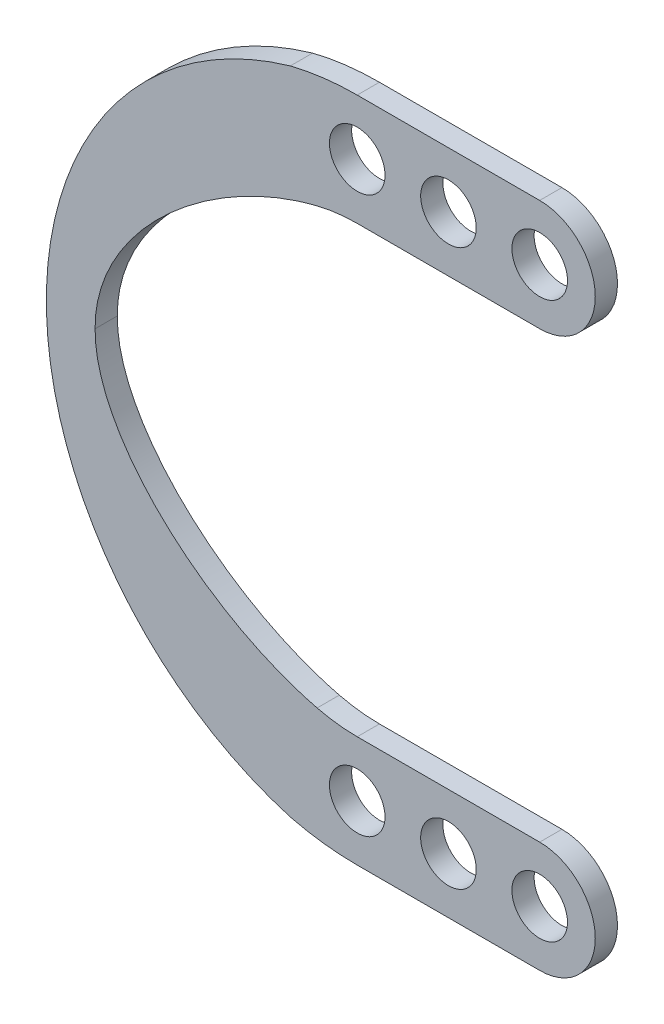
ISO-10303-21;
HEADER;
FILE_DESCRIPTION(('STEP AP214'),'2;1');
FILE_NAME('part.step','',(''),(''),'','','');
FILE_SCHEMA(('AUTOMOTIVE_DESIGN { 1 0 10303 214 1 1 1 1 }'));
ENDSEC;
DATA;
#1=APPLICATION_CONTEXT('core data for automotive mechanical design processes');
#2=APPLICATION_PROTOCOL_DEFINITION('international standard','automotive_design',2000,#1);
#3=PRODUCT_CONTEXT('',#1,'mechanical');
#4=PRODUCT('Part','Part','',(#3));
#5=PRODUCT_RELATED_PRODUCT_CATEGORY('part','',(#4));
#6=PRODUCT_DEFINITION_FORMATION('','',#4);
#7=PRODUCT_DEFINITION_CONTEXT('part definition',#1,'design');
#8=PRODUCT_DEFINITION('design','',#6,#7);
#9=PRODUCT_DEFINITION_SHAPE('','',#8);
#10=(LENGTH_UNIT() NAMED_UNIT(*) SI_UNIT(.MILLI.,.METRE.));
#11=(NAMED_UNIT(*) PLANE_ANGLE_UNIT() SI_UNIT($,.RADIAN.));
#12=(NAMED_UNIT(*) SI_UNIT($,.STERADIAN.) SOLID_ANGLE_UNIT());
#13=UNCERTAINTY_MEASURE_WITH_UNIT(LENGTH_MEASURE(1.E-05),#10,'distance_accuracy_value','');
#14=(GEOMETRIC_REPRESENTATION_CONTEXT(3) GLOBAL_UNCERTAINTY_ASSIGNED_CONTEXT((#13)) GLOBAL_UNIT_ASSIGNED_CONTEXT((#10,
#11,#12)) REPRESENTATION_CONTEXT('',''));
#15=CARTESIAN_POINT('',(0.,0.,0.));
#16=DIRECTION('',(0.,0.,1.));
#17=DIRECTION('',(1.,0.,0.));
#18=AXIS2_PLACEMENT_3D('',#15,#16,#17);
#19=CARTESIAN_POINT('',(0.,0.,2.));
#20=CARTESIAN_POINT('',(-0.0933459762474879,-8.13219904614453,2.));
#21=CARTESIAN_POINT('',(9.98710230848334,-17.0850852007355,2.));
#22=CARTESIAN_POINT('',(19.9745764255448,-19.5597289191086,2.));
#23=B_SPLINE_CURVE_WITH_KNOTS('',3,(#19,#20,#21,#22),.UNSPECIFIED.,.F.,.F.,(4,4),(0.,1.),.UNSPECIFIED.);
#24=DIRECTION('',(0.,0.,-1.));
#25=VECTOR('',#24,1.);
#26=SURFACE_OF_LINEAR_EXTRUSION('',#23,#25);
#27=CARTESIAN_POINT('',(0.,0.,0.));
#28=CARTESIAN_POINT('',(-0.0933459762474879,-8.13219904614453,0.));
#29=CARTESIAN_POINT('',(9.98710230848334,-17.0850852007355,0.));
#30=CARTESIAN_POINT('',(19.9745764255448,-19.5597289191086,0.));
#31=B_SPLINE_CURVE_WITH_KNOTS('',3,(#27,#28,#29,#30),.UNSPECIFIED.,.F.,.F.,(4,4),(0.,1.),.UNSPECIFIED.);
#32=CARTESIAN_POINT('',(0.,0.,0.));
#33=VERTEX_POINT('',#32);
#34=CARTESIAN_POINT('',(19.9745764255448,-19.5597289191086,0.));
#35=VERTEX_POINT('',#34);
#36=EDGE_CURVE('E180',#33,#35,#31,.T.);
#37=ORIENTED_EDGE('',*,*,#36,.F.);
#38=DIRECTION('',(0.,0.,-1.));
#39=VECTOR('',#38,1.);
#40=CARTESIAN_POINT('',(0.,0.,2.));
#41=LINE('',#40,#39);
#42=CARTESIAN_POINT('',(0.,0.,2.));
#43=VERTEX_POINT('',#42);
#44=EDGE_CURVE('E11',#43,#33,#41,.T.);
#45=ORIENTED_EDGE('',*,*,#44,.F.);
#46=CARTESIAN_POINT('',(19.9745764255448,-19.5597289191086,2.));
#47=VERTEX_POINT('',#46);
#48=EDGE_CURVE('E239',#43,#47,#23,.T.);
#49=ORIENTED_EDGE('',*,*,#48,.T.);
#50=DIRECTION('',(0.,0.,-1.));
#51=VECTOR('',#50,1.);
#52=CARTESIAN_POINT('',(19.9745764255448,-19.5597289191086,2.));
#53=LINE('',#52,#51);
#54=EDGE_CURVE('E54',#47,#35,#53,.T.);
#55=ORIENTED_EDGE('',*,*,#54,.T.);
#56=EDGE_LOOP('',(#37,#45,#49,#55));
#57=FACE_BOUND('',#56,.T.);
#58=ADVANCED_FACE('F37',(#57),#26,.T.);
#59=CARTESIAN_POINT('',(0.,0.,2.));
#60=CARTESIAN_POINT('',(-0.0933459762474879,8.13219904614453,2.));
#61=CARTESIAN_POINT('',(9.98710230848334,17.0850852007355,2.));
#62=CARTESIAN_POINT('',(19.9745764255448,19.5597289191086,2.));
#63=B_SPLINE_CURVE_WITH_KNOTS('',3,(#59,#60,#61,#62),.UNSPECIFIED.,.F.,.F.,(4,4),(0.,1.),.UNSPECIFIED.);
#64=DIRECTION('',(0.,0.,-1.));
#65=VECTOR('',#64,1.);
#66=SURFACE_OF_LINEAR_EXTRUSION('',#63,#65);
#67=CARTESIAN_POINT('',(0.,0.,0.));
#68=CARTESIAN_POINT('',(-0.0933459762474879,8.13219904614453,0.));
#69=CARTESIAN_POINT('',(9.98710230848334,17.0850852007355,0.));
#70=CARTESIAN_POINT('',(19.9745764255448,19.5597289191086,0.));
#71=B_SPLINE_CURVE_WITH_KNOTS('',3,(#67,#68,#69,#70),.UNSPECIFIED.,.F.,.F.,(4,4),(0.,1.),.UNSPECIFIED.);
#72=CARTESIAN_POINT('',(19.9745764255448,19.5597289191086,0.));
#73=VERTEX_POINT('',#72);
#74=EDGE_CURVE('E184',#33,#73,#71,.T.);
#75=ORIENTED_EDGE('',*,*,#74,.T.);
#76=DIRECTION('',(0.,0.,-1.));
#77=VECTOR('',#76,1.);
#78=CARTESIAN_POINT('',(19.9745764255448,19.5597289191086,2.));
#79=LINE('',#78,#77);
#80=CARTESIAN_POINT('',(19.9745764255448,19.5597289191086,2.));
#81=VERTEX_POINT('',#80);
#82=EDGE_CURVE('E46',#81,#73,#79,.T.);
#83=ORIENTED_EDGE('',*,*,#82,.F.);
#84=EDGE_CURVE('E285',#43,#81,#63,.T.);
#85=ORIENTED_EDGE('',*,*,#84,.F.);
#86=ORIENTED_EDGE('',*,*,#44,.T.);
#87=EDGE_LOOP('',(#75,#83,#85,#86));
#88=FACE_BOUND('',#87,.T.);
#89=ADVANCED_FACE('F324',(#88),#66,.F.);
#90=CARTESIAN_POINT('',(23.5821093501447,5.,2.));
#91=DIRECTION('',(0.,0.,-1.));
#92=DIRECTION('',(-1.,0.,0.));
#93=AXIS2_PLACEMENT_3D('',#90,#91,#92);
#94=CYLINDRICAL_SURFACE('',#93,15.);
#95=CARTESIAN_POINT('',(23.5821093501447,5.,0.));
#96=DIRECTION('',(0.,0.,1.));
#97=DIRECTION('',(1.,0.,0.));
#98=AXIS2_PLACEMENT_3D('',#95,#96,#97);
#99=CIRCLE('',#98,15.);
#100=CARTESIAN_POINT('',(23.5821093501447,20.,0.));
#101=VERTEX_POINT('',#100);
#102=EDGE_CURVE('E191',#73,#101,#99,.F.);
#103=ORIENTED_EDGE('',*,*,#102,.T.);
#104=DIRECTION('',(0.,0.,-1.));
#105=VECTOR('',#104,1.);
#106=CARTESIAN_POINT('',(23.5821093501447,20.,2.));
#107=LINE('',#106,#105);
#108=CARTESIAN_POINT('',(23.5821093501447,20.,2.));
#109=VERTEX_POINT('',#108);
#110=EDGE_CURVE('E257',#109,#101,#107,.T.);
#111=ORIENTED_EDGE('',*,*,#110,.F.);
#112=CARTESIAN_POINT('',(23.5821093501447,5.,2.));
#113=DIRECTION('',(0.,0.,1.));
#114=DIRECTION('',(1.,0.,0.));
#115=AXIS2_PLACEMENT_3D('',#112,#113,#114);
#116=CIRCLE('',#115,15.);
#117=EDGE_CURVE('E266',#81,#109,#116,.F.);
#118=ORIENTED_EDGE('',*,*,#117,.F.);
#119=ORIENTED_EDGE('',*,*,#82,.T.);
#120=EDGE_LOOP('',(#103,#111,#118,#119));
#121=FACE_BOUND('',#120,.T.);
#122=ADVANCED_FACE('F264',(#121),#94,.F.);
#123=CARTESIAN_POINT('',(0.,20.,2.));
#124=DIRECTION('',(0.,1.,0.));
#125=DIRECTION('',(0.,0.,1.));
#126=AXIS2_PLACEMENT_3D('',#123,#124,#125);
#127=PLANE('',#126);
#128=DIRECTION('',(1.,0.,0.));
#129=VECTOR('',#128,1.);
#130=CARTESIAN_POINT('',(0.,20.,0.));
#131=LINE('',#130,#129);
#132=CARTESIAN_POINT('',(40.,20.,0.));
#133=VERTEX_POINT('',#132);
#134=EDGE_CURVE('E196',#101,#133,#131,.T.);
#135=ORIENTED_EDGE('',*,*,#134,.T.);
#136=DIRECTION('',(0.,0.,-1.));
#137=VECTOR('',#136,1.);
#138=CARTESIAN_POINT('',(40.,20.,2.));
#139=LINE('',#138,#137);
#140=CARTESIAN_POINT('',(40.,20.,2.));
#141=VERTEX_POINT('',#140);
#142=EDGE_CURVE('E255',#141,#133,#139,.T.);
#143=ORIENTED_EDGE('',*,*,#142,.F.);
#144=DIRECTION('',(1.,0.,0.));
#145=VECTOR('',#144,1.);
#146=CARTESIAN_POINT('',(0.,20.,2.));
#147=LINE('',#146,#145);
#148=EDGE_CURVE('E279',#109,#141,#147,.T.);
#149=ORIENTED_EDGE('',*,*,#148,.F.);
#150=ORIENTED_EDGE('',*,*,#110,.T.);
#151=EDGE_LOOP('',(#135,#143,#149,#150));
#152=FACE_BOUND('',#151,.T.);
#153=ADVANCED_FACE('F276',(#152),#127,.F.);
#154=CARTESIAN_POINT('',(40.,25.,2.));
#155=DIRECTION('',(0.,0.,-1.));
#156=DIRECTION('',(-1.,0.,0.));
#157=AXIS2_PLACEMENT_3D('',#154,#155,#156);
#158=CYLINDRICAL_SURFACE('',#157,5.);
#159=CARTESIAN_POINT('',(40.,25.,0.));
#160=DIRECTION('',(0.,0.,1.));
#161=DIRECTION('',(1.,0.,0.));
#162=AXIS2_PLACEMENT_3D('',#159,#160,#161);
#163=CIRCLE('',#162,5.);
#164=CARTESIAN_POINT('',(40.,30.,0.));
#165=VERTEX_POINT('',#164);
#166=EDGE_CURVE('E199',#165,#133,#163,.F.);
#167=ORIENTED_EDGE('',*,*,#166,.F.);
#168=DIRECTION('',(0.,0.,-1.));
#169=VECTOR('',#168,1.);
#170=CARTESIAN_POINT('',(40.,30.,2.));
#171=LINE('',#170,#169);
#172=CARTESIAN_POINT('',(40.,30.,2.));
#173=VERTEX_POINT('',#172);
#174=EDGE_CURVE('E253',#173,#165,#171,.T.);
#175=ORIENTED_EDGE('',*,*,#174,.F.);
#176=CARTESIAN_POINT('',(40.,25.,2.));
#177=DIRECTION('',(0.,0.,1.));
#178=DIRECTION('',(1.,0.,0.));
#179=AXIS2_PLACEMENT_3D('',#176,#177,#178);
#180=CIRCLE('',#179,5.);
#181=EDGE_CURVE('E281',#173,#141,#180,.F.);
#182=ORIENTED_EDGE('',*,*,#181,.T.);
#183=ORIENTED_EDGE('',*,*,#142,.T.);
#184=EDGE_LOOP('',(#167,#175,#182,#183));
#185=FACE_BOUND('',#184,.T.);
#186=ADVANCED_FACE('F347',(#185),#158,.T.);
#187=CARTESIAN_POINT('',(0.,30.,2.));
#188=DIRECTION('',(0.,1.,0.));
#189=DIRECTION('',(-1.,0.,0.));
#190=AXIS2_PLACEMENT_3D('',#187,#188,#189);
#191=PLANE('',#190);
#192=DIRECTION('',(1.,0.,0.));
#193=VECTOR('',#192,1.);
#194=CARTESIAN_POINT('',(0.,30.,0.));
#195=LINE('',#194,#193);
#196=CARTESIAN_POINT('',(23.5821093501447,30.,0.));
#197=VERTEX_POINT('',#196);
#198=EDGE_CURVE('E202',#197,#165,#195,.T.);
#199=ORIENTED_EDGE('',*,*,#198,.F.);
#200=DIRECTION('',(0.,0.,-1.));
#201=VECTOR('',#200,1.);
#202=CARTESIAN_POINT('',(23.5821093501447,30.,2.));
#203=LINE('',#202,#201);
#204=CARTESIAN_POINT('',(23.5821093501447,30.,2.));
#205=VERTEX_POINT('',#204);
#206=EDGE_CURVE('E251',#205,#197,#203,.T.);
#207=ORIENTED_EDGE('',*,*,#206,.F.);
#208=DIRECTION('',(1.,0.,0.));
#209=VECTOR('',#208,1.);
#210=CARTESIAN_POINT('',(0.,30.,2.));
#211=LINE('',#210,#209);
#212=EDGE_CURVE('E283',#205,#173,#211,.T.);
#213=ORIENTED_EDGE('',*,*,#212,.T.);
#214=ORIENTED_EDGE('',*,*,#174,.T.);
#215=EDGE_LOOP('',(#199,#207,#213,#214));
#216=FACE_BOUND('',#215,.T.);
#217=ADVANCED_FACE('F350',(#216),#191,.T.);
#218=CARTESIAN_POINT('',(23.5821093501447,5.,2.));
#219=DIRECTION('',(0.,0.,-1.));
#220=DIRECTION('',(-1.,0.,0.));
#221=AXIS2_PLACEMENT_3D('',#218,#219,#220);
#222=CYLINDRICAL_SURFACE('',#221,25.);
#223=CARTESIAN_POINT('',(23.5821093501447,5.,0.));
#224=DIRECTION('',(0.,0.,1.));
#225=DIRECTION('',(1.,0.,0.));
#226=AXIS2_PLACEMENT_3D('',#223,#224,#225);
#227=CIRCLE('',#226,25.);
#228=CARTESIAN_POINT('',(17.5695544758116,29.266214865181,0.));
#229=VERTEX_POINT('',#228);
#230=EDGE_CURVE('E205',#229,#197,#227,.F.);
#231=ORIENTED_EDGE('',*,*,#230,.F.);
#232=DIRECTION('',(0.,0.,-1.));
#233=VECTOR('',#232,1.);
#234=CARTESIAN_POINT('',(17.5695544758116,29.266214865181,2.));
#235=LINE('',#234,#233);
#236=CARTESIAN_POINT('',(17.5695544758116,29.266214865181,2.));
#237=VERTEX_POINT('',#236);
#238=EDGE_CURVE('E249',#237,#229,#235,.T.);
#239=ORIENTED_EDGE('',*,*,#238,.F.);
#240=CARTESIAN_POINT('',(23.5821093501447,5.,2.));
#241=DIRECTION('',(0.,0.,1.));
#242=DIRECTION('',(1.,0.,0.));
#243=AXIS2_PLACEMENT_3D('',#240,#241,#242);
#244=CIRCLE('',#243,25.);
#245=EDGE_CURVE('E291',#237,#205,#244,.F.);
#246=ORIENTED_EDGE('',*,*,#245,.T.);
#247=ORIENTED_EDGE('',*,*,#206,.T.);
#248=EDGE_LOOP('',(#231,#239,#246,#247));
#249=FACE_BOUND('',#248,.T.);
#250=ADVANCED_FACE('F354',(#249),#222,.T.);
#251=CARTESIAN_POINT('',(26.0948576319707,0.,2.));
#252=DIRECTION('',(0.,0.,-1.));
#253=DIRECTION('',(-1.,0.,0.));
#254=AXIS2_PLACEMENT_3D('',#251,#252,#253);
#255=CYLINDRICAL_SURFACE('',#254,30.4826528773229);
#256=CARTESIAN_POINT('',(26.0948576319707,0.,0.));
#257=DIRECTION('',(0.,0.,1.));
#258=DIRECTION('',(1.,0.,0.));
#259=AXIS2_PLACEMENT_3D('',#256,#257,#258);
#260=CIRCLE('',#259,30.4826528773229);
#261=CARTESIAN_POINT('',(17.5695544758116,-29.266214865181,0.));
#262=VERTEX_POINT('',#261);
#263=EDGE_CURVE('E208',#229,#262,#260,.T.);
#264=ORIENTED_EDGE('',*,*,#263,.T.);
#265=DIRECTION('',(0.,0.,-1.));
#266=VECTOR('',#265,1.);
#267=CARTESIAN_POINT('',(17.5695544758116,-29.266214865181,2.));
#268=LINE('',#267,#266);
#269=CARTESIAN_POINT('',(17.5695544758116,-29.266214865181,2.));
#270=VERTEX_POINT('',#269);
#271=EDGE_CURVE('E246',#270,#262,#268,.T.);
#272=ORIENTED_EDGE('',*,*,#271,.F.);
#273=CARTESIAN_POINT('',(26.0948576319707,0.,2.));
#274=DIRECTION('',(0.,0.,1.));
#275=DIRECTION('',(1.,0.,0.));
#276=AXIS2_PLACEMENT_3D('',#273,#274,#275);
#277=CIRCLE('',#276,30.4826528773229);
#278=EDGE_CURVE('E294',#237,#270,#277,.T.);
#279=ORIENTED_EDGE('',*,*,#278,.F.);
#280=ORIENTED_EDGE('',*,*,#238,.T.);
#281=EDGE_LOOP('',(#264,#272,#279,#280));
#282=FACE_BOUND('',#281,.T.);
#283=ADVANCED_FACE('F358',(#282),#255,.T.);
#284=CARTESIAN_POINT('',(23.5821093501447,-5.,2.));
#285=DIRECTION('',(0.,0.,-1.));
#286=DIRECTION('',(-1.,0.,0.));
#287=AXIS2_PLACEMENT_3D('',#284,#285,#286);
#288=CYLINDRICAL_SURFACE('',#287,25.);
#289=CARTESIAN_POINT('',(23.5821093501447,-5.,0.));
#290=DIRECTION('',(0.,0.,1.));
#291=DIRECTION('',(1.,0.,0.));
#292=AXIS2_PLACEMENT_3D('',#289,#290,#291);
#293=CIRCLE('',#292,25.);
#294=CARTESIAN_POINT('',(23.5821093501447,-30.,0.));
#295=VERTEX_POINT('',#294);
#296=EDGE_CURVE('E210',#262,#295,#293,.T.);
#297=ORIENTED_EDGE('',*,*,#296,.T.);
#298=DIRECTION('',(0.,0.,-1.));
#299=VECTOR('',#298,1.);
#300=CARTESIAN_POINT('',(23.5821093501447,-30.,2.));
#301=LINE('',#300,#299);
#302=CARTESIAN_POINT('',(23.5821093501447,-30.,2.));
#303=VERTEX_POINT('',#302);
#304=EDGE_CURVE('E243',#303,#295,#301,.T.);
#305=ORIENTED_EDGE('',*,*,#304,.F.);
#306=CARTESIAN_POINT('',(23.5821093501447,-5.,2.));
#307=DIRECTION('',(0.,0.,1.));
#308=DIRECTION('',(1.,0.,0.));
#309=AXIS2_PLACEMENT_3D('',#306,#307,#308);
#310=CIRCLE('',#309,25.);
#311=EDGE_CURVE('E296',#270,#303,#310,.T.);
#312=ORIENTED_EDGE('',*,*,#311,.F.);
#313=ORIENTED_EDGE('',*,*,#271,.T.);
#314=EDGE_LOOP('',(#297,#305,#312,#313));
#315=FACE_BOUND('',#314,.T.);
#316=ADVANCED_FACE('F303',(#315),#288,.T.);
#317=CARTESIAN_POINT('',(0.,-30.,2.));
#318=DIRECTION('',(0.,1.,0.));
#319=DIRECTION('',(0.,0.,1.));
#320=AXIS2_PLACEMENT_3D('',#317,#318,#319);
#321=PLANE('',#320);
#322=DIRECTION('',(1.,0.,0.));
#323=VECTOR('',#322,1.);
#324=CARTESIAN_POINT('',(0.,-30.,0.));
#325=LINE('',#324,#323);
#326=CARTESIAN_POINT('',(40.,-30.,0.));
#327=VERTEX_POINT('',#326);
#328=EDGE_CURVE('E212',#295,#327,#325,.T.);
#329=ORIENTED_EDGE('',*,*,#328,.T.);
#330=DIRECTION('',(0.,0.,-1.));
#331=VECTOR('',#330,1.);
#332=CARTESIAN_POINT('',(40.,-30.,2.));
#333=LINE('',#332,#331);
#334=CARTESIAN_POINT('',(40.,-30.,2.));
#335=VERTEX_POINT('',#334);
#336=EDGE_CURVE('E143',#335,#327,#333,.T.);
#337=ORIENTED_EDGE('',*,*,#336,.F.);
#338=DIRECTION('',(1.,0.,0.));
#339=VECTOR('',#338,1.);
#340=CARTESIAN_POINT('',(0.,-30.,2.));
#341=LINE('',#340,#339);
#342=EDGE_CURVE('E153',#303,#335,#341,.T.);
#343=ORIENTED_EDGE('',*,*,#342,.F.);
#344=ORIENTED_EDGE('',*,*,#304,.T.);
#345=EDGE_LOOP('',(#329,#337,#343,#344));
#346=FACE_BOUND('',#345,.T.);
#347=ADVANCED_FACE('F307',(#346),#321,.F.);
#348=CARTESIAN_POINT('',(40.,-25.,2.));
#349=DIRECTION('',(0.,0.,-1.));
#350=DIRECTION('',(-1.,0.,0.));
#351=AXIS2_PLACEMENT_3D('',#348,#349,#350);
#352=CYLINDRICAL_SURFACE('',#351,5.);
#353=CARTESIAN_POINT('',(40.,-25.,0.));
#354=DIRECTION('',(0.,0.,1.));
#355=DIRECTION('',(1.,0.,0.));
#356=AXIS2_PLACEMENT_3D('',#353,#354,#355);
#357=CIRCLE('',#356,5.);
#358=CARTESIAN_POINT('',(40.,-20.,0.));
#359=VERTEX_POINT('',#358);
#360=EDGE_CURVE('E139',#359,#327,#357,.F.);
#361=ORIENTED_EDGE('',*,*,#360,.F.);
#362=DIRECTION('',(0.,0.,-1.));
#363=VECTOR('',#362,1.);
#364=CARTESIAN_POINT('',(40.,-20.,2.));
#365=LINE('',#364,#363);
#366=CARTESIAN_POINT('',(40.,-20.,2.));
#367=VERTEX_POINT('',#366);
#368=EDGE_CURVE('E134',#367,#359,#365,.T.);
#369=ORIENTED_EDGE('',*,*,#368,.F.);
#370=CARTESIAN_POINT('',(40.,-25.,2.));
#371=DIRECTION('',(0.,0.,1.));
#372=DIRECTION('',(1.,0.,0.));
#373=AXIS2_PLACEMENT_3D('',#370,#371,#372);
#374=CIRCLE('',#373,5.);
#375=EDGE_CURVE('E137',#367,#335,#374,.F.);
#376=ORIENTED_EDGE('',*,*,#375,.T.);
#377=ORIENTED_EDGE('',*,*,#336,.T.);
#378=EDGE_LOOP('',(#361,#369,#376,#377));
#379=FACE_BOUND('',#378,.T.);
#380=ADVANCED_FACE('F136',(#379),#352,.T.);
#381=CARTESIAN_POINT('',(0.,-20.,2.));
#382=DIRECTION('',(0.,1.,0.));
#383=DIRECTION('',(0.,0.,1.));
#384=AXIS2_PLACEMENT_3D('',#381,#382,#383);
#385=PLANE('',#384);
#386=DIRECTION('',(1.,0.,0.));
#387=VECTOR('',#386,1.);
#388=CARTESIAN_POINT('',(0.,-20.,0.));
#389=LINE('',#388,#387);
#390=CARTESIAN_POINT('',(23.5821093501447,-20.,0.));
#391=VERTEX_POINT('',#390);
#392=EDGE_CURVE('E216',#391,#359,#389,.T.);
#393=ORIENTED_EDGE('',*,*,#392,.F.);
#394=DIRECTION('',(0.,0.,-1.));
#395=VECTOR('',#394,1.);
#396=CARTESIAN_POINT('',(23.5821093501447,-20.,2.));
#397=LINE('',#396,#395);
#398=CARTESIAN_POINT('',(23.5821093501447,-20.,2.));
#399=VERTEX_POINT('',#398);
#400=EDGE_CURVE('E94',#399,#391,#397,.T.);
#401=ORIENTED_EDGE('',*,*,#400,.F.);
#402=DIRECTION('',(1.,0.,0.));
#403=VECTOR('',#402,1.);
#404=CARTESIAN_POINT('',(0.,-20.,2.));
#405=LINE('',#404,#403);
#406=EDGE_CURVE('E151',#399,#367,#405,.T.);
#407=ORIENTED_EDGE('',*,*,#406,.T.);
#408=ORIENTED_EDGE('',*,*,#368,.T.);
#409=EDGE_LOOP('',(#393,#401,#407,#408));
#410=FACE_BOUND('',#409,.T.);
#411=ADVANCED_FACE('F156',(#410),#385,.T.);
#412=CARTESIAN_POINT('',(31.7910546750724,25.,2.));
#413=DIRECTION('',(0.,0.,-1.));
#414=DIRECTION('',(-1.,0.,0.));
#415=AXIS2_PLACEMENT_3D('',#412,#413,#414);
#416=CYLINDRICAL_SURFACE('',#415,2.5);
#417=CARTESIAN_POINT('',(31.7910546750724,25.,2.));
#418=DIRECTION('',(0.,0.,1.));
#419=DIRECTION('',(1.,0.,0.));
#420=AXIS2_PLACEMENT_3D('',#417,#418,#419);
#421=CIRCLE('',#420,2.5);
#422=CARTESIAN_POINT('',(34.2910546750724,25.,2.));
#423=VERTEX_POINT('',#422);
#424=EDGE_CURVE('E174',#423,#423,#421,.T.);
#425=ORIENTED_EDGE('',*,*,#424,.T.);
#426=EDGE_LOOP('',(#425));
#427=FACE_BOUND('',#426,.T.);
#428=CARTESIAN_POINT('',(31.7910546750724,25.,0.));
#429=DIRECTION('',(0.,0.,1.));
#430=DIRECTION('',(1.,0.,0.));
#431=AXIS2_PLACEMENT_3D('',#428,#429,#430);
#432=CIRCLE('',#431,2.5);
#433=CARTESIAN_POINT('',(34.2910546750724,25.,0.));
#434=VERTEX_POINT('',#433);
#435=EDGE_CURVE('E233',#434,#434,#432,.T.);
#436=ORIENTED_EDGE('',*,*,#435,.F.);
#437=EDGE_LOOP('',(#436));
#438=FACE_BOUND('',#437,.T.);
#439=ADVANCED_FACE('F369',(#427,#438),#416,.F.);
#440=CARTESIAN_POINT('',(23.5821093501447,25.,2.));
#441=DIRECTION('',(0.,0.,-1.));
#442=DIRECTION('',(-1.,0.,0.));
#443=AXIS2_PLACEMENT_3D('',#440,#441,#442);
#444=CYLINDRICAL_SURFACE('',#443,2.5);
#445=CARTESIAN_POINT('',(23.5821093501447,25.,2.));
#446=DIRECTION('',(0.,0.,1.));
#447=DIRECTION('',(1.,0.,0.));
#448=AXIS2_PLACEMENT_3D('',#445,#446,#447);
#449=CIRCLE('',#448,2.5);
#450=CARTESIAN_POINT('',(26.0821093501447,25.,2.));
#451=VERTEX_POINT('',#450);
#452=EDGE_CURVE('E171',#451,#451,#449,.T.);
#453=ORIENTED_EDGE('',*,*,#452,.T.);
#454=EDGE_LOOP('',(#453));
#455=FACE_BOUND('',#454,.T.);
#456=CARTESIAN_POINT('',(23.5821093501447,25.,0.));
#457=DIRECTION('',(0.,0.,1.));
#458=DIRECTION('',(1.,0.,0.));
#459=AXIS2_PLACEMENT_3D('',#456,#457,#458);
#460=CIRCLE('',#459,2.5);
#461=CARTESIAN_POINT('',(26.0821093501447,25.,0.));
#462=VERTEX_POINT('',#461);
#463=EDGE_CURVE('E230',#462,#462,#460,.T.);
#464=ORIENTED_EDGE('',*,*,#463,.F.);
#465=EDGE_LOOP('',(#464));
#466=FACE_BOUND('',#465,.T.);
#467=ADVANCED_FACE('F373',(#455,#466),#444,.F.);
#468=CARTESIAN_POINT('',(40.,-25.,2.));
#469=DIRECTION('',(0.,0.,-1.));
#470=DIRECTION('',(-1.,0.,0.));
#471=AXIS2_PLACEMENT_3D('',#468,#469,#470);
#472=CYLINDRICAL_SURFACE('',#471,2.5);
#473=CARTESIAN_POINT('',(40.,-25.,2.));
#474=DIRECTION('',(0.,0.,1.));
#475=DIRECTION('',(1.,0.,0.));
#476=AXIS2_PLACEMENT_3D('',#473,#474,#475);
#477=CIRCLE('',#476,2.5);
#478=CARTESIAN_POINT('',(42.5,-25.,2.));
#479=VERTEX_POINT('',#478);
#480=EDGE_CURVE('E168',#479,#479,#477,.T.);
#481=ORIENTED_EDGE('',*,*,#480,.T.);
#482=EDGE_LOOP('',(#481));
#483=FACE_BOUND('',#482,.T.);
#484=CARTESIAN_POINT('',(40.,-25.,0.));
#485=DIRECTION('',(0.,0.,1.));
#486=DIRECTION('',(1.,0.,0.));
#487=AXIS2_PLACEMENT_3D('',#484,#485,#486);
#488=CIRCLE('',#487,2.5);
#489=CARTESIAN_POINT('',(42.5,-25.,0.));
#490=VERTEX_POINT('',#489);
#491=EDGE_CURVE('E227',#490,#490,#488,.T.);
#492=ORIENTED_EDGE('',*,*,#491,.F.);
#493=EDGE_LOOP('',(#492));
#494=FACE_BOUND('',#493,.T.);
#495=ADVANCED_FACE('F379',(#483,#494),#472,.F.);
#496=CARTESIAN_POINT('',(31.7910546750724,-25.,2.));
#497=DIRECTION('',(0.,0.,-1.));
#498=DIRECTION('',(-1.,0.,0.));
#499=AXIS2_PLACEMENT_3D('',#496,#497,#498);
#500=CYLINDRICAL_SURFACE('',#499,2.5);
#501=CARTESIAN_POINT('',(31.7910546750724,-25.,2.));
#502=DIRECTION('',(0.,0.,1.));
#503=DIRECTION('',(1.,0.,0.));
#504=AXIS2_PLACEMENT_3D('',#501,#502,#503);
#505=CIRCLE('',#504,2.5);
#506=CARTESIAN_POINT('',(34.2910546750724,-25.,2.));
#507=VERTEX_POINT('',#506);
#508=EDGE_CURVE('E165',#507,#507,#505,.T.);
#509=ORIENTED_EDGE('',*,*,#508,.T.);
#510=EDGE_LOOP('',(#509));
#511=FACE_BOUND('',#510,.T.);
#512=CARTESIAN_POINT('',(31.7910546750724,-25.,0.));
#513=DIRECTION('',(0.,0.,1.));
#514=DIRECTION('',(1.,0.,0.));
#515=AXIS2_PLACEMENT_3D('',#512,#513,#514);
#516=CIRCLE('',#515,2.5);
#517=CARTESIAN_POINT('',(34.2910546750724,-25.,0.));
#518=VERTEX_POINT('',#517);
#519=EDGE_CURVE('E224',#518,#518,#516,.T.);
#520=ORIENTED_EDGE('',*,*,#519,.F.);
#521=EDGE_LOOP('',(#520));
#522=FACE_BOUND('',#521,.T.);
#523=ADVANCED_FACE('F319',(#511,#522),#500,.F.);
#524=CARTESIAN_POINT('',(23.5821093501447,-25.,2.));
#525=DIRECTION('',(0.,0.,-1.));
#526=DIRECTION('',(-1.,0.,0.));
#527=AXIS2_PLACEMENT_3D('',#524,#525,#526);
#528=CYLINDRICAL_SURFACE('',#527,2.5);
#529=CARTESIAN_POINT('',(23.5821093501447,-25.,2.));
#530=DIRECTION('',(0.,0.,1.));
#531=DIRECTION('',(1.,0.,0.));
#532=AXIS2_PLACEMENT_3D('',#529,#530,#531);
#533=CIRCLE('',#532,2.5);
#534=CARTESIAN_POINT('',(26.0821093501447,-25.,2.));
#535=VERTEX_POINT('',#534);
#536=EDGE_CURVE('E159',#535,#535,#533,.T.);
#537=ORIENTED_EDGE('',*,*,#536,.T.);
#538=EDGE_LOOP('',(#537));
#539=FACE_BOUND('',#538,.T.);
#540=CARTESIAN_POINT('',(23.5821093501447,-25.,0.));
#541=DIRECTION('',(0.,0.,1.));
#542=DIRECTION('',(1.,0.,0.));
#543=AXIS2_PLACEMENT_3D('',#540,#541,#542);
#544=CIRCLE('',#543,2.5);
#545=CARTESIAN_POINT('',(26.0821093501447,-25.,0.));
#546=VERTEX_POINT('',#545);
#547=EDGE_CURVE('E221',#546,#546,#544,.T.);
#548=ORIENTED_EDGE('',*,*,#547,.F.);
#549=EDGE_LOOP('',(#548));
#550=FACE_BOUND('',#549,.T.);
#551=ADVANCED_FACE('F311',(#539,#550),#528,.F.);
#552=CARTESIAN_POINT('',(23.5821093501447,-5.,2.));
#553=DIRECTION('',(0.,0.,-1.));
#554=DIRECTION('',(-1.,0.,0.));
#555=AXIS2_PLACEMENT_3D('',#552,#553,#554);
#556=CYLINDRICAL_SURFACE('',#555,15.);
#557=CARTESIAN_POINT('',(23.5821093501447,-5.,0.));
#558=DIRECTION('',(0.,0.,1.));
#559=DIRECTION('',(1.,0.,0.));
#560=AXIS2_PLACEMENT_3D('',#557,#558,#559);
#561=CIRCLE('',#560,15.);
#562=EDGE_CURVE('E218',#35,#391,#561,.T.);
#563=ORIENTED_EDGE('',*,*,#562,.F.);
#564=ORIENTED_EDGE('',*,*,#54,.F.);
#565=CARTESIAN_POINT('',(23.5821093501447,-5.,2.));
#566=DIRECTION('',(0.,0.,1.));
#567=DIRECTION('',(1.,0.,0.));
#568=AXIS2_PLACEMENT_3D('',#565,#566,#567);
#569=CIRCLE('',#568,15.);
#570=EDGE_CURVE('E157',#47,#399,#569,.T.);
#571=ORIENTED_EDGE('',*,*,#570,.T.);
#572=ORIENTED_EDGE('',*,*,#400,.T.);
#573=EDGE_LOOP('',(#563,#564,#571,#572));
#574=FACE_BOUND('',#573,.T.);
#575=ADVANCED_FACE('F308',(#574),#556,.F.);
#576=CARTESIAN_POINT('',(40.,25.,2.));
#577=DIRECTION('',(0.,0.,-1.));
#578=DIRECTION('',(-1.,0.,0.));
#579=AXIS2_PLACEMENT_3D('',#576,#577,#578);
#580=CYLINDRICAL_SURFACE('',#579,2.5);
#581=CARTESIAN_POINT('',(40.,25.,2.));
#582=DIRECTION('',(0.,0.,1.));
#583=DIRECTION('',(1.,0.,0.));
#584=AXIS2_PLACEMENT_3D('',#581,#582,#583);
#585=CIRCLE('',#584,2.5);
#586=CARTESIAN_POINT('',(42.5,25.,2.));
#587=VERTEX_POINT('',#586);
#588=EDGE_CURVE('E177',#587,#587,#585,.T.);
#589=ORIENTED_EDGE('',*,*,#588,.T.);
#590=EDGE_LOOP('',(#589));
#591=FACE_BOUND('',#590,.T.);
#592=CARTESIAN_POINT('',(40.,25.,0.));
#593=DIRECTION('',(0.,0.,1.));
#594=DIRECTION('',(1.,0.,0.));
#595=AXIS2_PLACEMENT_3D('',#592,#593,#594);
#596=CIRCLE('',#595,2.5);
#597=CARTESIAN_POINT('',(42.5,25.,0.));
#598=VERTEX_POINT('',#597);
#599=EDGE_CURVE('E236',#598,#598,#596,.T.);
#600=ORIENTED_EDGE('',*,*,#599,.F.);
#601=EDGE_LOOP('',(#600));
#602=FACE_BOUND('',#601,.T.);
#603=ADVANCED_FACE('F310',(#591,#602),#580,.F.);
#604=CARTESIAN_POINT('',(0.,0.,2.));
#605=DIRECTION('',(0.,0.,1.));
#606=DIRECTION('',(1.,0.,0.));
#607=AXIS2_PLACEMENT_3D('',#604,#605,#606);
#608=PLANE('',#607);
#609=ORIENTED_EDGE('',*,*,#48,.F.);
#610=ORIENTED_EDGE('',*,*,#84,.T.);
#611=ORIENTED_EDGE('',*,*,#117,.T.);
#612=ORIENTED_EDGE('',*,*,#148,.T.);
#613=ORIENTED_EDGE('',*,*,#181,.F.);
#614=ORIENTED_EDGE('',*,*,#212,.F.);
#615=ORIENTED_EDGE('',*,*,#245,.F.);
#616=ORIENTED_EDGE('',*,*,#278,.T.);
#617=ORIENTED_EDGE('',*,*,#311,.T.);
#618=ORIENTED_EDGE('',*,*,#342,.T.);
#619=ORIENTED_EDGE('',*,*,#375,.F.);
#620=ORIENTED_EDGE('',*,*,#406,.F.);
#621=ORIENTED_EDGE('',*,*,#570,.F.);
#622=EDGE_LOOP('',(#609,#610,#611,#612,#613,#614,#615,#616,#617,#618,#619,#620,#621));
#623=FACE_BOUND('',#622,.T.);
#624=ORIENTED_EDGE('',*,*,#536,.F.);
#625=EDGE_LOOP('',(#624));
#626=FACE_BOUND('',#625,.T.);
#627=ORIENTED_EDGE('',*,*,#508,.F.);
#628=EDGE_LOOP('',(#627));
#629=FACE_BOUND('',#628,.T.);
#630=ORIENTED_EDGE('',*,*,#480,.F.);
#631=EDGE_LOOP('',(#630));
#632=FACE_BOUND('',#631,.T.);
#633=ORIENTED_EDGE('',*,*,#452,.F.);
#634=EDGE_LOOP('',(#633));
#635=FACE_BOUND('',#634,.T.);
#636=ORIENTED_EDGE('',*,*,#424,.F.);
#637=EDGE_LOOP('',(#636));
#638=FACE_BOUND('',#637,.T.);
#639=ORIENTED_EDGE('',*,*,#588,.F.);
#640=EDGE_LOOP('',(#639));
#641=FACE_BOUND('',#640,.T.);
#642=ADVANCED_FACE('F148',(#623,#626,#629,#632,#635,#638,#641),#608,.T.);
#643=CARTESIAN_POINT('',(0.,0.,0.));
#644=DIRECTION('',(0.,0.,1.));
#645=DIRECTION('',(1.,0.,0.));
#646=AXIS2_PLACEMENT_3D('',#643,#644,#645);
#647=PLANE('',#646);
#648=ORIENTED_EDGE('',*,*,#36,.T.);
#649=ORIENTED_EDGE('',*,*,#562,.T.);
#650=ORIENTED_EDGE('',*,*,#392,.T.);
#651=ORIENTED_EDGE('',*,*,#360,.T.);
#652=ORIENTED_EDGE('',*,*,#328,.F.);
#653=ORIENTED_EDGE('',*,*,#296,.F.);
#654=ORIENTED_EDGE('',*,*,#263,.F.);
#655=ORIENTED_EDGE('',*,*,#230,.T.);
#656=ORIENTED_EDGE('',*,*,#198,.T.);
#657=ORIENTED_EDGE('',*,*,#166,.T.);
#658=ORIENTED_EDGE('',*,*,#134,.F.);
#659=ORIENTED_EDGE('',*,*,#102,.F.);
#660=ORIENTED_EDGE('',*,*,#74,.F.);
#661=EDGE_LOOP('',(#648,#649,#650,#651,#652,#653,#654,#655,#656,#657,#658,#659,#660));
#662=FACE_BOUND('',#661,.T.);
#663=ORIENTED_EDGE('',*,*,#547,.T.);
#664=EDGE_LOOP('',(#663));
#665=FACE_BOUND('',#664,.T.);
#666=ORIENTED_EDGE('',*,*,#519,.T.);
#667=EDGE_LOOP('',(#666));
#668=FACE_BOUND('',#667,.T.);
#669=ORIENTED_EDGE('',*,*,#491,.T.);
#670=EDGE_LOOP('',(#669));
#671=FACE_BOUND('',#670,.T.);
#672=ORIENTED_EDGE('',*,*,#463,.T.);
#673=EDGE_LOOP('',(#672));
#674=FACE_BOUND('',#673,.T.);
#675=ORIENTED_EDGE('',*,*,#435,.T.);
#676=EDGE_LOOP('',(#675));
#677=FACE_BOUND('',#676,.T.);
#678=ORIENTED_EDGE('',*,*,#599,.T.);
#679=EDGE_LOOP('',(#678));
#680=FACE_BOUND('',#679,.T.);
#681=ADVANCED_FACE('F271',(#662,#665,#668,#671,#674,#677,#680),#647,.F.);
#682=CLOSED_SHELL('',(#58,#89,#122,#153,#186,#217,#250,#283,#316,#347,#380,#411,#439,#467,#495,
#523,#551,#575,#603,#642,#681));
#683=MANIFOLD_SOLID_BREP('B2',#682);
#684=ADVANCED_BREP_SHAPE_REPRESENTATION('',(#18,#683),#14);
#685=SHAPE_DEFINITION_REPRESENTATION(#9,#684);
ENDSEC;
END-ISO-10303-21;
